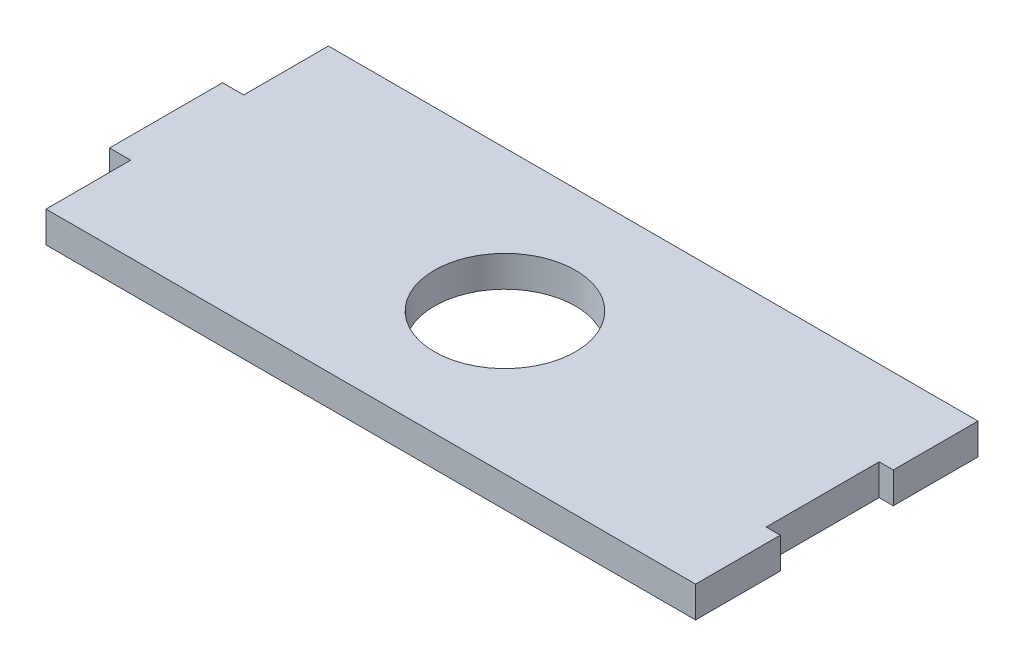
ISO-10303-21;
HEADER;
FILE_DESCRIPTION(('STEP AP214'),'2;1');
FILE_NAME('part.step','',(''),(''),'','','');
FILE_SCHEMA(('AUTOMOTIVE_DESIGN { 1 0 10303 214 1 1 1 1 }'));
ENDSEC;
DATA;
#1=APPLICATION_CONTEXT('core data for automotive mechanical design processes');
#2=APPLICATION_PROTOCOL_DEFINITION('international standard','automotive_design',2000,#1);
#3=PRODUCT_CONTEXT('',#1,'mechanical');
#4=PRODUCT('Part','Part','',(#3));
#5=PRODUCT_RELATED_PRODUCT_CATEGORY('part','',(#4));
#6=PRODUCT_DEFINITION_FORMATION('','',#4);
#7=PRODUCT_DEFINITION_CONTEXT('part definition',#1,'design');
#8=PRODUCT_DEFINITION('design','',#6,#7);
#9=PRODUCT_DEFINITION_SHAPE('','',#8);
#10=(LENGTH_UNIT() NAMED_UNIT(*) SI_UNIT(.MILLI.,.METRE.));
#11=(NAMED_UNIT(*) PLANE_ANGLE_UNIT() SI_UNIT($,.RADIAN.));
#12=(NAMED_UNIT(*) SI_UNIT($,.STERADIAN.) SOLID_ANGLE_UNIT());
#13=UNCERTAINTY_MEASURE_WITH_UNIT(LENGTH_MEASURE(1.E-05),#10,'distance_accuracy_value','');
#14=(GEOMETRIC_REPRESENTATION_CONTEXT(3) GLOBAL_UNCERTAINTY_ASSIGNED_CONTEXT((#13)) GLOBAL_UNIT_ASSIGNED_CONTEXT((#10,
#11,#12)) REPRESENTATION_CONTEXT('',''));
#15=CARTESIAN_POINT('',(0.,0.,0.));
#16=DIRECTION('',(0.,0.,1.));
#17=DIRECTION('',(1.,0.,0.));
#18=AXIS2_PLACEMENT_3D('',#15,#16,#17);
#19=CARTESIAN_POINT('',(-137.304574568671,2.2,-2.54064500120833E-12));
#20=DIRECTION('',(-1.,0.,0.));
#21=DIRECTION('',(0.,0.,1.));
#22=AXIS2_PLACEMENT_3D('',#19,#20,#21);
#23=PLANE('',#22);
#24=DIRECTION('',(0.,0.,-1.));
#25=VECTOR('',#24,1.);
#26=CARTESIAN_POINT('',(-137.304574568671,0.,-2.54064500120833E-12));
#27=LINE('',#26,#25);
#28=CARTESIAN_POINT('',(-137.304574568671,0.,23.4022872843317));
#29=VERTEX_POINT('',#28);
#30=CARTESIAN_POINT('',(-137.304574568671,0.,17.4022872843251));
#31=VERTEX_POINT('',#30);
#32=EDGE_CURVE('E192',#29,#31,#27,.T.);
#33=ORIENTED_EDGE('',*,*,#32,.F.);
#34=DIRECTION('',(0.,-1.,0.));
#35=VECTOR('',#34,1.);
#36=CARTESIAN_POINT('',(-137.304574568671,2.2,23.4022872843317));
#37=LINE('',#36,#35);
#38=CARTESIAN_POINT('',(-137.304574568671,2.2,23.4022872843317));
#39=VERTEX_POINT('',#38);
#40=EDGE_CURVE('E11',#39,#29,#37,.T.);
#41=ORIENTED_EDGE('',*,*,#40,.F.);
#42=DIRECTION('',(0.,0.,-1.));
#43=VECTOR('',#42,1.);
#44=CARTESIAN_POINT('',(-137.304574568671,2.2,-2.54064500120833E-12));
#45=LINE('',#44,#43);
#46=CARTESIAN_POINT('',(-137.304574568671,2.2,17.4022872843251));
#47=VERTEX_POINT('',#46);
#48=EDGE_CURVE('E271',#39,#47,#45,.T.);
#49=ORIENTED_EDGE('',*,*,#48,.T.);
#50=DIRECTION('',(0.,-1.,0.));
#51=VECTOR('',#50,1.);
#52=CARTESIAN_POINT('',(-137.304574568671,2.2,17.4022872843251));
#53=LINE('',#52,#51);
#54=EDGE_CURVE('E100',#47,#31,#53,.T.);
#55=ORIENTED_EDGE('',*,*,#54,.T.);
#56=EDGE_LOOP('',(#33,#41,#49,#55));
#57=FACE_BOUND('',#56,.T.);
#58=ADVANCED_FACE('F37',(#57),#23,.T.);
#59=CARTESIAN_POINT('',(-8.66058605732075E-13,2.2,23.4022872843368));
#60=DIRECTION('',(0.,0.,-1.));
#61=DIRECTION('',(-1.,0.,0.));
#62=AXIS2_PLACEMENT_3D('',#59,#60,#61);
#63=PLANE('',#62);
#64=DIRECTION('',(1.,0.,0.));
#65=VECTOR('',#64,1.);
#66=CARTESIAN_POINT('',(-8.66058605732075E-13,0.,23.4022872843368));
#67=LINE('',#66,#65);
#68=CARTESIAN_POINT('',(-138.804574568663,0.,23.4022872843317));
#69=VERTEX_POINT('',#68);
#70=EDGE_CURVE('E186',#69,#29,#67,.T.);
#71=ORIENTED_EDGE('',*,*,#70,.F.);
#72=DIRECTION('',(0.,-1.,0.));
#73=VECTOR('',#72,1.);
#74=CARTESIAN_POINT('',(-138.804574568663,2.2,23.4022872843317));
#75=LINE('',#74,#73);
#76=CARTESIAN_POINT('',(-138.804574568663,2.2,23.4022872843317));
#77=VERTEX_POINT('',#76);
#78=EDGE_CURVE('E46',#77,#69,#75,.T.);
#79=ORIENTED_EDGE('',*,*,#78,.F.);
#80=DIRECTION('',(1.,0.,0.));
#81=VECTOR('',#80,1.);
#82=CARTESIAN_POINT('',(-8.66058605732075E-13,2.2,23.4022872843368));
#83=LINE('',#82,#81);
#84=EDGE_CURVE('E273',#77,#39,#83,.T.);
#85=ORIENTED_EDGE('',*,*,#84,.T.);
#86=ORIENTED_EDGE('',*,*,#40,.T.);
#87=EDGE_LOOP('',(#71,#79,#85,#86));
#88=FACE_BOUND('',#87,.T.);
#89=ADVANCED_FACE('F191',(#88),#63,.T.);
#90=CARTESIAN_POINT('',(-138.804574568663,2.2,0.));
#91=DIRECTION('',(1.,0.,0.));
#92=DIRECTION('',(0.,0.,-1.));
#93=AXIS2_PLACEMENT_3D('',#90,#91,#92);
#94=PLANE('',#93);
#95=DIRECTION('',(0.,0.,1.));
#96=VECTOR('',#95,1.);
#97=CARTESIAN_POINT('',(-138.804574568663,0.,0.));
#98=LINE('',#97,#96);
#99=CARTESIAN_POINT('',(-138.804574568663,0.,31.4022872843317));
#100=VERTEX_POINT('',#99);
#101=EDGE_CURVE('E177',#69,#100,#98,.T.);
#102=ORIENTED_EDGE('',*,*,#101,.T.);
#103=DIRECTION('',(0.,-1.,0.));
#104=VECTOR('',#103,1.);
#105=CARTESIAN_POINT('',(-138.804574568663,2.2,31.4022872843317));
#106=LINE('',#105,#104);
#107=CARTESIAN_POINT('',(-138.804574568663,2.2,31.4022872843317));
#108=VERTEX_POINT('',#107);
#109=EDGE_CURVE('E170',#108,#100,#106,.T.);
#110=ORIENTED_EDGE('',*,*,#109,.F.);
#111=DIRECTION('',(0.,0.,1.));
#112=VECTOR('',#111,1.);
#113=CARTESIAN_POINT('',(-138.804574568663,2.2,0.));
#114=LINE('',#113,#112);
#115=EDGE_CURVE('E179',#77,#108,#114,.T.);
#116=ORIENTED_EDGE('',*,*,#115,.F.);
#117=ORIENTED_EDGE('',*,*,#78,.T.);
#118=EDGE_LOOP('',(#102,#110,#116,#117));
#119=FACE_BOUND('',#118,.T.);
#120=ADVANCED_FACE('F175',(#119),#94,.F.);
#121=CARTESIAN_POINT('',(-1.16211807896548E-12,2.2,31.4022872843368));
#122=DIRECTION('',(0.,0.,1.));
#123=DIRECTION('',(1.,0.,0.));
#124=AXIS2_PLACEMENT_3D('',#121,#122,#123);
#125=PLANE('',#124);
#126=DIRECTION('',(-1.,0.,0.));
#127=VECTOR('',#126,1.);
#128=CARTESIAN_POINT('',(-1.16211807896548E-12,0.,31.4022872843368));
#129=LINE('',#128,#127);
#130=CARTESIAN_POINT('',(-137.304574568671,0.,31.4022872843317));
#131=VERTEX_POINT('',#130);
#132=EDGE_CURVE('E189',#131,#100,#129,.T.);
#133=ORIENTED_EDGE('',*,*,#132,.F.);
#134=DIRECTION('',(0.,-1.,0.));
#135=VECTOR('',#134,1.);
#136=CARTESIAN_POINT('',(-137.304574568671,2.2,31.4022872843317));
#137=LINE('',#136,#135);
#138=CARTESIAN_POINT('',(-137.304574568671,2.2,31.4022872843317));
#139=VERTEX_POINT('',#138);
#140=EDGE_CURVE('E168',#139,#131,#137,.T.);
#141=ORIENTED_EDGE('',*,*,#140,.F.);
#142=DIRECTION('',(-1.,0.,0.));
#143=VECTOR('',#142,1.);
#144=CARTESIAN_POINT('',(-1.16211807896548E-12,2.2,31.4022872843368));
#145=LINE('',#144,#143);
#146=EDGE_CURVE('E278',#139,#108,#145,.T.);
#147=ORIENTED_EDGE('',*,*,#146,.T.);
#148=ORIENTED_EDGE('',*,*,#109,.T.);
#149=EDGE_LOOP('',(#133,#141,#147,#148));
#150=FACE_BOUND('',#149,.T.);
#151=ADVANCED_FACE('F242',(#150),#125,.T.);
#152=CARTESIAN_POINT('',(-137.304574568671,2.2,-2.54064500120838E-12));
#153=DIRECTION('',(-1.,0.,0.));
#154=DIRECTION('',(0.,0.,1.));
#155=AXIS2_PLACEMENT_3D('',#152,#153,#154);
#156=PLANE('',#155);
#157=DIRECTION('',(0.,0.,-1.));
#158=VECTOR('',#157,1.);
#159=CARTESIAN_POINT('',(-137.304574568671,0.,-2.54064500120838E-12));
#160=LINE('',#159,#158);
#161=CARTESIAN_POINT('',(-137.304574568672,0.,37.402287284325));
#162=VERTEX_POINT('',#161);
#163=EDGE_CURVE('E199',#162,#131,#160,.T.);
#164=ORIENTED_EDGE('',*,*,#163,.F.);
#165=DIRECTION('',(0.,-1.,0.));
#166=VECTOR('',#165,1.);
#167=CARTESIAN_POINT('',(-137.304574568672,2.2,37.402287284325));
#168=LINE('',#167,#166);
#169=CARTESIAN_POINT('',(-137.304574568672,2.2,37.402287284325));
#170=VERTEX_POINT('',#169);
#171=EDGE_CURVE('E166',#170,#162,#168,.T.);
#172=ORIENTED_EDGE('',*,*,#171,.F.);
#173=DIRECTION('',(0.,0.,-1.));
#174=VECTOR('',#173,1.);
#175=CARTESIAN_POINT('',(-137.304574568671,2.2,-2.54064500120838E-12));
#176=LINE('',#175,#174);
#177=EDGE_CURVE('E281',#170,#139,#176,.T.);
#178=ORIENTED_EDGE('',*,*,#177,.T.);
#179=ORIENTED_EDGE('',*,*,#140,.T.);
#180=EDGE_LOOP('',(#164,#172,#178,#179));
#181=FACE_BOUND('',#180,.T.);
#182=ADVANCED_FACE('F245',(#181),#156,.T.);
#183=CARTESIAN_POINT('',(0.,2.2,37.402287284325));
#184=DIRECTION('',(0.,0.,1.));
#185=DIRECTION('',(1.,0.,0.));
#186=AXIS2_PLACEMENT_3D('',#183,#184,#185);
#187=PLANE('',#186);
#188=DIRECTION('',(-1.,0.,0.));
#189=VECTOR('',#188,1.);
#190=CARTESIAN_POINT('',(0.,0.,37.402287284325));
#191=LINE('',#190,#189);
#192=CARTESIAN_POINT('',(-91.3045745686288,0.,37.4022872843672));
#193=VERTEX_POINT('',#192);
#194=EDGE_CURVE('E201',#193,#162,#191,.T.);
#195=ORIENTED_EDGE('',*,*,#194,.F.);
#196=DIRECTION('',(0.,-1.,0.));
#197=VECTOR('',#196,1.);
#198=CARTESIAN_POINT('',(-91.3045745686288,2.2,37.4022872843672));
#199=LINE('',#198,#197);
#200=CARTESIAN_POINT('',(-91.3045745686288,2.2,37.4022872843672));
#201=VERTEX_POINT('',#200);
#202=EDGE_CURVE('E164',#201,#193,#199,.T.);
#203=ORIENTED_EDGE('',*,*,#202,.F.);
#204=DIRECTION('',(-1.,0.,0.));
#205=VECTOR('',#204,1.);
#206=CARTESIAN_POINT('',(0.,2.2,37.402287284325));
#207=LINE('',#206,#205);
#208=EDGE_CURVE('E284',#201,#170,#207,.T.);
#209=ORIENTED_EDGE('',*,*,#208,.T.);
#210=ORIENTED_EDGE('',*,*,#171,.T.);
#211=EDGE_LOOP('',(#195,#203,#209,#210));
#212=FACE_BOUND('',#211,.T.);
#213=ADVANCED_FACE('F249',(#212),#187,.T.);
#214=CARTESIAN_POINT('',(-91.3045745686284,2.2,-1.01368440939696E-12));
#215=DIRECTION('',(-1.,0.,0.));
#216=DIRECTION('',(0.,0.,1.));
#217=AXIS2_PLACEMENT_3D('',#214,#215,#216);
#218=PLANE('',#217);
#219=DIRECTION('',(0.,0.,-1.));
#220=VECTOR('',#219,1.);
#221=CARTESIAN_POINT('',(-91.3045745686284,0.,-1.01368440939696E-12));
#222=LINE('',#221,#220);
#223=CARTESIAN_POINT('',(-91.3045745686288,0.,31.4022872843672));
#224=VERTEX_POINT('',#223);
#225=EDGE_CURVE('E204',#193,#224,#222,.T.);
#226=ORIENTED_EDGE('',*,*,#225,.T.);
#227=DIRECTION('',(0.,-1.,0.));
#228=VECTOR('',#227,1.);
#229=CARTESIAN_POINT('',(-91.3045745686288,2.2,31.4022872843672));
#230=LINE('',#229,#228);
#231=CARTESIAN_POINT('',(-91.3045745686288,2.2,31.4022872843672));
#232=VERTEX_POINT('',#231);
#233=EDGE_CURVE('E161',#232,#224,#230,.T.);
#234=ORIENTED_EDGE('',*,*,#233,.F.);
#235=DIRECTION('',(0.,0.,-1.));
#236=VECTOR('',#235,1.);
#237=CARTESIAN_POINT('',(-91.3045745686284,2.2,-1.01368440939696E-12));
#238=LINE('',#237,#236);
#239=EDGE_CURVE('E141',#201,#232,#238,.T.);
#240=ORIENTED_EDGE('',*,*,#239,.F.);
#241=ORIENTED_EDGE('',*,*,#202,.T.);
#242=EDGE_LOOP('',(#226,#234,#240,#241));
#243=FACE_BOUND('',#242,.T.);
#244=ADVANCED_FACE('F232',(#243),#218,.F.);
#245=CARTESIAN_POINT('',(0.,2.2,31.4022872843672));
#246=DIRECTION('',(0.,0.,1.));
#247=DIRECTION('',(1.,0.,0.));
#248=AXIS2_PLACEMENT_3D('',#245,#246,#247);
#249=PLANE('',#248);
#250=DIRECTION('',(-1.,0.,0.));
#251=VECTOR('',#250,1.);
#252=CARTESIAN_POINT('',(0.,0.,31.4022872843672));
#253=LINE('',#252,#251);
#254=CARTESIAN_POINT('',(-92.3045745686287,0.,31.4022872843672));
#255=VERTEX_POINT('',#254);
#256=EDGE_CURVE('E207',#224,#255,#253,.T.);
#257=ORIENTED_EDGE('',*,*,#256,.T.);
#258=DIRECTION('',(0.,-1.,0.));
#259=VECTOR('',#258,1.);
#260=CARTESIAN_POINT('',(-92.3045745686287,2.2,31.4022872843672));
#261=LINE('',#260,#259);
#262=CARTESIAN_POINT('',(-92.3045745686287,2.2,31.4022872843672));
#263=VERTEX_POINT('',#262);
#264=EDGE_CURVE('E154',#263,#255,#261,.T.);
#265=ORIENTED_EDGE('',*,*,#264,.F.);
#266=DIRECTION('',(-1.,0.,0.));
#267=VECTOR('',#266,1.);
#268=CARTESIAN_POINT('',(0.,2.2,31.4022872843672));
#269=LINE('',#268,#267);
#270=EDGE_CURVE('E288',#232,#263,#269,.T.);
#271=ORIENTED_EDGE('',*,*,#270,.F.);
#272=ORIENTED_EDGE('',*,*,#233,.T.);
#273=EDGE_LOOP('',(#257,#265,#271,#272));
#274=FACE_BOUND('',#273,.T.);
#275=ADVANCED_FACE('F254',(#274),#249,.F.);
#276=CARTESIAN_POINT('',(-92.3045745686283,2.2,-1.28098329955401E-12));
#277=DIRECTION('',(-1.,0.,0.));
#278=DIRECTION('',(0.,0.,1.));
#279=AXIS2_PLACEMENT_3D('',#276,#277,#278);
#280=PLANE('',#279);
#281=DIRECTION('',(0.,0.,-1.));
#282=VECTOR('',#281,1.);
#283=CARTESIAN_POINT('',(-92.3045745686283,0.,-1.28098329955401E-12));
#284=LINE('',#283,#282);
#285=CARTESIAN_POINT('',(-92.3045745686286,0.,23.4022872843672));
#286=VERTEX_POINT('',#285);
#287=EDGE_CURVE('E211',#255,#286,#284,.T.);
#288=ORIENTED_EDGE('',*,*,#287,.T.);
#289=DIRECTION('',(0.,-1.,0.));
#290=VECTOR('',#289,1.);
#291=CARTESIAN_POINT('',(-92.3045745686286,2.2,23.4022872843672));
#292=LINE('',#291,#290);
#293=CARTESIAN_POINT('',(-92.3045745686286,2.2,23.4022872843672));
#294=VERTEX_POINT('',#293);
#295=EDGE_CURVE('E152',#294,#286,#292,.T.);
#296=ORIENTED_EDGE('',*,*,#295,.F.);
#297=DIRECTION('',(0.,0.,-1.));
#298=VECTOR('',#297,1.);
#299=CARTESIAN_POINT('',(-92.3045745686283,2.2,-1.28098329955401E-12));
#300=LINE('',#299,#298);
#301=EDGE_CURVE('E145',#263,#294,#300,.T.);
#302=ORIENTED_EDGE('',*,*,#301,.F.);
#303=ORIENTED_EDGE('',*,*,#264,.T.);
#304=EDGE_LOOP('',(#288,#296,#302,#303));
#305=FACE_BOUND('',#304,.T.);
#306=ADVANCED_FACE('F257',(#305),#280,.F.);
#307=CARTESIAN_POINT('',(0.,2.2,23.4022872843672));
#308=DIRECTION('',(0.,0.,-1.));
#309=DIRECTION('',(-1.,0.,0.));
#310=AXIS2_PLACEMENT_3D('',#307,#308,#309);
#311=PLANE('',#310);
#312=DIRECTION('',(1.,0.,0.));
#313=VECTOR('',#312,1.);
#314=CARTESIAN_POINT('',(0.,0.,23.4022872843672));
#315=LINE('',#314,#313);
#316=CARTESIAN_POINT('',(-91.3045745686287,0.,23.4022872843672));
#317=VERTEX_POINT('',#316);
#318=EDGE_CURVE('E151',#286,#317,#315,.T.);
#319=ORIENTED_EDGE('',*,*,#318,.T.);
#320=DIRECTION('',(0.,-1.,0.));
#321=VECTOR('',#320,1.);
#322=CARTESIAN_POINT('',(-91.3045745686287,2.2,23.4022872843672));
#323=LINE('',#322,#321);
#324=CARTESIAN_POINT('',(-91.3045745686287,2.2,23.4022872843672));
#325=VERTEX_POINT('',#324);
#326=EDGE_CURVE('E136',#325,#317,#323,.T.);
#327=ORIENTED_EDGE('',*,*,#326,.F.);
#328=DIRECTION('',(1.,0.,0.));
#329=VECTOR('',#328,1.);
#330=CARTESIAN_POINT('',(0.,2.2,23.4022872843672));
#331=LINE('',#330,#329);
#332=EDGE_CURVE('E139',#294,#325,#331,.T.);
#333=ORIENTED_EDGE('',*,*,#332,.F.);
#334=ORIENTED_EDGE('',*,*,#295,.T.);
#335=EDGE_LOOP('',(#319,#327,#333,#334));
#336=FACE_BOUND('',#335,.T.);
#337=ADVANCED_FACE('F150',(#336),#311,.F.);
#338=CARTESIAN_POINT('',(-91.3045745686286,0.,17.4022872843673));
#339=VERTEX_POINT('',#338);
#340=EDGE_CURVE('E208',#317,#339,#222,.T.);
#341=ORIENTED_EDGE('',*,*,#340,.T.);
#342=DIRECTION('',(0.,-1.,0.));
#343=VECTOR('',#342,1.);
#344=CARTESIAN_POINT('',(-91.3045745686286,2.2,17.4022872843673));
#345=LINE('',#344,#343);
#346=CARTESIAN_POINT('',(-91.3045745686286,2.2,17.4022872843673));
#347=VERTEX_POINT('',#346);
#348=EDGE_CURVE('E138',#347,#339,#345,.T.);
#349=ORIENTED_EDGE('',*,*,#348,.F.);
#350=EDGE_CURVE('E131',#325,#347,#238,.T.);
#351=ORIENTED_EDGE('',*,*,#350,.F.);
#352=ORIENTED_EDGE('',*,*,#326,.T.);
#353=EDGE_LOOP('',(#341,#349,#351,#352));
#354=FACE_BOUND('',#353,.T.);
#355=ADVANCED_FACE('F134',(#354),#218,.F.);
#356=CARTESIAN_POINT('',(-114.805151385314,2.2,27.4022872843363));
#357=DIRECTION('',(0.,-1.,0.));
#358=DIRECTION('',(0.,0.,-1.));
#359=AXIS2_PLACEMENT_3D('',#356,#357,#358);
#360=CYLINDRICAL_SURFACE('',#359,5.00000000000003);
#361=CARTESIAN_POINT('',(-114.805151385314,2.2,27.4022872843363));
#362=DIRECTION('',(0.,1.,0.));
#363=DIRECTION('',(0.,0.,1.));
#364=AXIS2_PLACEMENT_3D('',#361,#362,#363);
#365=CIRCLE('',#364,5.00000000000003);
#366=CARTESIAN_POINT('',(-114.805151385314,2.2,32.4022872843363));
#367=VERTEX_POINT('',#366);
#368=EDGE_CURVE('E215',#367,#367,#365,.T.);
#369=ORIENTED_EDGE('',*,*,#368,.T.);
#370=EDGE_LOOP('',(#369));
#371=FACE_BOUND('',#370,.T.);
#372=CARTESIAN_POINT('',(-114.805151385314,0.,27.4022872843363));
#373=DIRECTION('',(0.,1.,0.));
#374=DIRECTION('',(0.,0.,1.));
#375=AXIS2_PLACEMENT_3D('',#372,#373,#374);
#376=CIRCLE('',#375,5.00000000000003);
#377=CARTESIAN_POINT('',(-114.805151385314,0.,32.4022872843363));
#378=VERTEX_POINT('',#377);
#379=EDGE_CURVE('E194',#378,#378,#376,.T.);
#380=ORIENTED_EDGE('',*,*,#379,.F.);
#381=EDGE_LOOP('',(#380));
#382=FACE_BOUND('',#381,.T.);
#383=ADVANCED_FACE('F39',(#371,#382),#360,.F.);
#384=CARTESIAN_POINT('',(0.,2.2,17.4022872843251));
#385=DIRECTION('',(0.,0.,1.));
#386=DIRECTION('',(1.,0.,0.));
#387=AXIS2_PLACEMENT_3D('',#384,#385,#386);
#388=PLANE('',#387);
#389=DIRECTION('',(-1.,0.,0.));
#390=VECTOR('',#389,1.);
#391=CARTESIAN_POINT('',(0.,0.,17.4022872843251));
#392=LINE('',#391,#390);
#393=EDGE_CURVE('E93',#339,#31,#392,.T.);
#394=ORIENTED_EDGE('',*,*,#393,.T.);
#395=ORIENTED_EDGE('',*,*,#54,.F.);
#396=DIRECTION('',(-1.,0.,0.));
#397=VECTOR('',#396,1.);
#398=CARTESIAN_POINT('',(0.,2.2,17.4022872843251));
#399=LINE('',#398,#397);
#400=EDGE_CURVE('E54',#347,#47,#399,.T.);
#401=ORIENTED_EDGE('',*,*,#400,.F.);
#402=ORIENTED_EDGE('',*,*,#348,.T.);
#403=EDGE_LOOP('',(#394,#395,#401,#402));
#404=FACE_BOUND('',#403,.T.);
#405=ADVANCED_FACE('F223',(#404),#388,.F.);
#406=CARTESIAN_POINT('',(0.,2.2,0.));
#407=DIRECTION('',(0.,1.,0.));
#408=DIRECTION('',(0.,0.,1.));
#409=AXIS2_PLACEMENT_3D('',#406,#407,#408);
#410=PLANE('',#409);
#411=ORIENTED_EDGE('',*,*,#368,.F.);
#412=EDGE_LOOP('',(#411));
#413=FACE_BOUND('',#412,.T.);
#414=ORIENTED_EDGE('',*,*,#48,.F.);
#415=ORIENTED_EDGE('',*,*,#84,.F.);
#416=ORIENTED_EDGE('',*,*,#115,.T.);
#417=ORIENTED_EDGE('',*,*,#146,.F.);
#418=ORIENTED_EDGE('',*,*,#177,.F.);
#419=ORIENTED_EDGE('',*,*,#208,.F.);
#420=ORIENTED_EDGE('',*,*,#239,.T.);
#421=ORIENTED_EDGE('',*,*,#270,.T.);
#422=ORIENTED_EDGE('',*,*,#301,.T.);
#423=ORIENTED_EDGE('',*,*,#332,.T.);
#424=ORIENTED_EDGE('',*,*,#350,.T.);
#425=ORIENTED_EDGE('',*,*,#400,.T.);
#426=EDGE_LOOP('',(#414,#415,#416,#417,#418,#419,#420,#421,#422,#423,#424,#425));
#427=FACE_BOUND('',#426,.T.);
#428=ADVANCED_FACE('F143',(#413,#427),#410,.T.);
#429=CARTESIAN_POINT('',(0.,0.,0.));
#430=DIRECTION('',(0.,1.,0.));
#431=DIRECTION('',(0.,0.,1.));
#432=AXIS2_PLACEMENT_3D('',#429,#430,#431);
#433=PLANE('',#432);
#434=ORIENTED_EDGE('',*,*,#379,.T.);
#435=EDGE_LOOP('',(#434));
#436=FACE_BOUND('',#435,.T.);
#437=ORIENTED_EDGE('',*,*,#32,.T.);
#438=ORIENTED_EDGE('',*,*,#393,.F.);
#439=ORIENTED_EDGE('',*,*,#340,.F.);
#440=ORIENTED_EDGE('',*,*,#318,.F.);
#441=ORIENTED_EDGE('',*,*,#287,.F.);
#442=ORIENTED_EDGE('',*,*,#256,.F.);
#443=ORIENTED_EDGE('',*,*,#225,.F.);
#444=ORIENTED_EDGE('',*,*,#194,.T.);
#445=ORIENTED_EDGE('',*,*,#163,.T.);
#446=ORIENTED_EDGE('',*,*,#132,.T.);
#447=ORIENTED_EDGE('',*,*,#101,.F.);
#448=ORIENTED_EDGE('',*,*,#70,.T.);
#449=EDGE_LOOP('',(#437,#438,#439,#440,#441,#442,#443,#444,#445,#446,#447,#448));
#450=FACE_BOUND('',#449,.T.);
#451=ADVANCED_FACE('F185',(#436,#450),#433,.F.);
#452=CLOSED_SHELL('',(#58,#89,#120,#151,#182,#213,#244,#275,#306,#337,#355,#383,#405,#428,#451));
#453=MANIFOLD_SOLID_BREP('B2',#452);
#454=ADVANCED_BREP_SHAPE_REPRESENTATION('',(#18,#453),#14);
#455=SHAPE_DEFINITION_REPRESENTATION(#9,#454);
ENDSEC;
END-ISO-10303-21;
